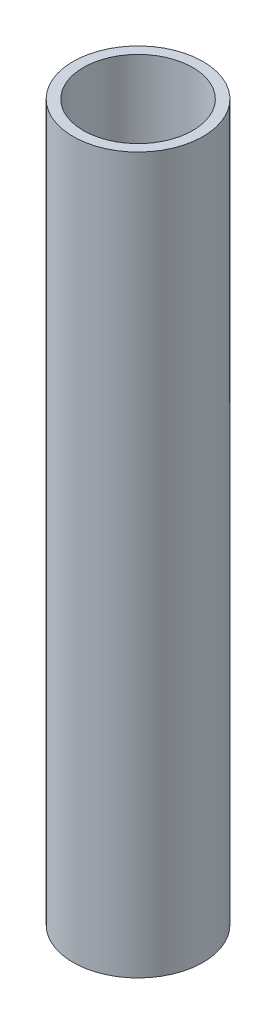
ISO-10303-21;
HEADER;
FILE_DESCRIPTION(('STEP AP214'),'2;1');
FILE_NAME('part.step','',(''),(''),'','','');
FILE_SCHEMA(('AUTOMOTIVE_DESIGN { 1 0 10303 214 1 1 1 1 }'));
ENDSEC;
DATA;
#1=APPLICATION_CONTEXT('core data for automotive mechanical design processes');
#2=APPLICATION_PROTOCOL_DEFINITION('international standard','automotive_design',2000,#1);
#3=PRODUCT_CONTEXT('',#1,'mechanical');
#4=PRODUCT('Part','Part','',(#3));
#5=PRODUCT_RELATED_PRODUCT_CATEGORY('part','',(#4));
#6=PRODUCT_DEFINITION_FORMATION('','',#4);
#7=PRODUCT_DEFINITION_CONTEXT('part definition',#1,'design');
#8=PRODUCT_DEFINITION('design','',#6,#7);
#9=PRODUCT_DEFINITION_SHAPE('','',#8);
#10=(LENGTH_UNIT() NAMED_UNIT(*) SI_UNIT(.MILLI.,.METRE.));
#11=(NAMED_UNIT(*) PLANE_ANGLE_UNIT() SI_UNIT($,.RADIAN.));
#12=(NAMED_UNIT(*) SI_UNIT($,.STERADIAN.) SOLID_ANGLE_UNIT());
#13=UNCERTAINTY_MEASURE_WITH_UNIT(LENGTH_MEASURE(1.E-05),#10,'distance_accuracy_value','');
#14=(GEOMETRIC_REPRESENTATION_CONTEXT(3) GLOBAL_UNCERTAINTY_ASSIGNED_CONTEXT((#13)) GLOBAL_UNIT_ASSIGNED_CONTEXT((#10,
#11,#12)) REPRESENTATION_CONTEXT('',''));
#15=CARTESIAN_POINT('',(0.,0.,0.));
#16=DIRECTION('',(0.,0.,1.));
#17=DIRECTION('',(1.,0.,0.));
#18=AXIS2_PLACEMENT_3D('',#15,#16,#17);
#19=CARTESIAN_POINT('',(0.,104.,0.));
#20=DIRECTION('',(0.,-1.,0.));
#21=DIRECTION('',(0.,0.,-1.));
#22=AXIS2_PLACEMENT_3D('',#19,#20,#21);
#23=CYLINDRICAL_SURFACE('',#22,9.45);
#24=CARTESIAN_POINT('',(0.,104.,0.));
#25=DIRECTION('',(0.,1.,0.));
#26=DIRECTION('',(0.,0.,1.));
#27=AXIS2_PLACEMENT_3D('',#24,#25,#26);
#28=CIRCLE('',#27,9.45);
#29=CARTESIAN_POINT('',(0.,104.,-9.45));
#30=VERTEX_POINT('',#29);
#31=EDGE_CURVE('E10',#30,#30,#28,.T.);
#32=CARTESIAN_POINT('',(0.,0.,0.));
#33=DIRECTION('',(0.,1.,0.));
#34=DIRECTION('',(0.,0.,1.));
#35=AXIS2_PLACEMENT_3D('',#32,#33,#34);
#36=CIRCLE('',#35,9.45);
#37=CARTESIAN_POINT('',(0.,0.,-9.45));
#38=VERTEX_POINT('',#37);
#39=EDGE_CURVE('E42',#38,#38,#36,.T.);
#40=CARTESIAN_POINT('',(0.,104.,-9.45));
#41=CARTESIAN_POINT('',(0.,102.916666666667,-9.45));
#42=CARTESIAN_POINT('',(0.,101.833333333333,-9.45));
#43=CARTESIAN_POINT('',(0.,99.6666666666667,-9.45));
#44=CARTESIAN_POINT('',(0.,98.5833333333333,-9.45));
#45=CARTESIAN_POINT('',(0.,96.4166666666667,-9.45));
#46=CARTESIAN_POINT('',(0.,95.3333333333333,-9.45));
#47=CARTESIAN_POINT('',(0.,93.1666666666667,-9.45));
#48=CARTESIAN_POINT('',(0.,92.0833333333333,-9.45));
#49=CARTESIAN_POINT('',(0.,89.9166666666667,-9.45));
#50=CARTESIAN_POINT('',(0.,88.8333333333333,-9.45));
#51=CARTESIAN_POINT('',(0.,86.6666666666667,-9.45));
#52=CARTESIAN_POINT('',(0.,85.5833333333333,-9.45));
#53=CARTESIAN_POINT('',(0.,83.4166666666667,-9.45));
#54=CARTESIAN_POINT('',(0.,82.3333333333333,-9.45));
#55=CARTESIAN_POINT('',(0.,80.1666666666666,-9.45));
#56=CARTESIAN_POINT('',(0.,79.0833333333333,-9.45));
#57=CARTESIAN_POINT('',(0.,76.9166666666667,-9.45));
#58=CARTESIAN_POINT('',(0.,75.8333333333333,-9.45));
#59=CARTESIAN_POINT('',(0.,73.6666666666667,-9.45));
#60=CARTESIAN_POINT('',(0.,72.5833333333333,-9.45));
#61=CARTESIAN_POINT('',(0.,70.4166666666667,-9.45));
#62=CARTESIAN_POINT('',(0.,69.3333333333333,-9.45));
#63=CARTESIAN_POINT('',(0.,67.1666666666667,-9.45));
#64=CARTESIAN_POINT('',(0.,66.0833333333333,-9.45));
#65=CARTESIAN_POINT('',(0.,63.9166666666667,-9.45));
#66=CARTESIAN_POINT('',(0.,62.8333333333333,-9.45));
#67=CARTESIAN_POINT('',(0.,60.6666666666667,-9.45));
#68=CARTESIAN_POINT('',(0.,59.5833333333333,-9.45));
#69=CARTESIAN_POINT('',(0.,57.4166666666667,-9.45));
#70=CARTESIAN_POINT('',(0.,56.3333333333333,-9.45));
#71=CARTESIAN_POINT('',(0.,54.1666666666667,-9.45));
#72=CARTESIAN_POINT('',(0.,53.0833333333333,-9.45));
#73=CARTESIAN_POINT('',(0.,50.9166666666667,-9.45));
#74=CARTESIAN_POINT('',(0.,49.8333333333333,-9.45));
#75=CARTESIAN_POINT('',(0.,47.6666666666667,-9.45));
#76=CARTESIAN_POINT('',(0.,46.5833333333333,-9.45));
#77=CARTESIAN_POINT('',(0.,44.4166666666667,-9.45));
#78=CARTESIAN_POINT('',(0.,43.3333333333333,-9.45));
#79=CARTESIAN_POINT('',(0.,41.1666666666667,-9.45));
#80=CARTESIAN_POINT('',(0.,40.0833333333333,-9.45));
#81=CARTESIAN_POINT('',(0.,37.9166666666667,-9.45));
#82=CARTESIAN_POINT('',(0.,36.8333333333333,-9.45));
#83=CARTESIAN_POINT('',(0.,34.6666666666667,-9.45));
#84=CARTESIAN_POINT('',(0.,33.5833333333333,-9.45));
#85=CARTESIAN_POINT('',(0.,31.4166666666667,-9.45));
#86=CARTESIAN_POINT('',(0.,30.3333333333333,-9.45));
#87=CARTESIAN_POINT('',(0.,28.1666666666667,-9.45));
#88=CARTESIAN_POINT('',(0.,27.0833333333333,-9.45));
#89=CARTESIAN_POINT('',(0.,24.9166666666667,-9.45));
#90=CARTESIAN_POINT('',(0.,23.8333333333333,-9.45));
#91=CARTESIAN_POINT('',(0.,21.6666666666667,-9.45));
#92=CARTESIAN_POINT('',(0.,20.5833333333333,-9.45));
#93=CARTESIAN_POINT('',(0.,18.4166666666667,-9.45));
#94=CARTESIAN_POINT('',(0.,17.3333333333333,-9.45));
#95=CARTESIAN_POINT('',(0.,15.1666666666667,-9.45));
#96=CARTESIAN_POINT('',(0.,14.0833333333333,-9.45));
#97=CARTESIAN_POINT('',(0.,11.9166666666667,-9.45));
#98=CARTESIAN_POINT('',(0.,10.8333333333333,-9.45));
#99=CARTESIAN_POINT('',(0.,8.66666666666666,-9.45));
#100=CARTESIAN_POINT('',(0.,7.58333333333333,-9.45));
#101=CARTESIAN_POINT('',(0.,5.41666666666667,-9.45));
#102=CARTESIAN_POINT('',(0.,4.33333333333334,-9.45));
#103=CARTESIAN_POINT('',(0.,2.16666666666667,-9.45));
#104=CARTESIAN_POINT('',(0.,1.08333333333333,-9.45));
#105=CARTESIAN_POINT('',(0.,0.,-9.45));
#106=B_SPLINE_CURVE_WITH_KNOTS('',3,(#40,#41,#42,#43,#44,#45,#46,#47,#48,#49,#50,#51,#52,#53,
#54,#55,#56,#57,#58,#59,#60,#61,#62,#63,#64,#65,#66,#67,#68,#69,#70,#71,#72,#73,#74,#75,#76,#77,
#78,#79,#80,#81,#82,#83,#84,#85,#86,#87,#88,#89,#90,#91,#92,#93,#94,#95,#96,#97,#98,#99,#100,
#101,#102,#103,#104,#105),.UNSPECIFIED.,.F.,.F.,(4,2,2,2,2,2,2,2,2,2,2,2,2,2,2,2,2,2,2,2,2,2,2,
2,2,2,2,2,2,2,2,2,4),(0.,3.24999999999999,6.49999999999999,9.74999999999999,13.,16.25,19.5,
22.75,26.,29.25,32.5,35.75,39.,42.25,45.5,48.75,52.,55.25,58.5,61.75,65.,68.25,71.5,74.75,78.,
81.25,84.5,87.75,91.,94.25,97.5,100.75,104.),.UNSPECIFIED.);
#107=EDGE_CURVE('BSEAM39',#30,#38,#106,.T.);
#108=ORIENTED_EDGE('',*,*,#31,.F.);
#109=ORIENTED_EDGE('',*,*,#39,.T.);
#110=ORIENTED_EDGE('',*,*,#107,.T.);
#111=ORIENTED_EDGE('',*,*,#107,.F.);
#112=EDGE_LOOP('',(#108,#110,#109,#111));
#113=FACE_BOUND('',#112,.T.);
#114=ADVANCED_FACE('F39',(#113),#23,.T.);
#115=CARTESIAN_POINT('',(0.,104.,0.));
#116=DIRECTION('',(0.,1.,0.));
#117=DIRECTION('',(0.,0.,1.));
#118=AXIS2_PLACEMENT_3D('',#115,#116,#117);
#119=PLANE('',#118);
#120=CARTESIAN_POINT('',(0.,104.,0.));
#121=DIRECTION('',(0.,1.,0.));
#122=DIRECTION('',(0.,0.,1.));
#123=AXIS2_PLACEMENT_3D('',#120,#121,#122);
#124=CIRCLE('',#123,7.95);
#125=CARTESIAN_POINT('',(0.,104.,7.95));
#126=VERTEX_POINT('',#125);
#127=EDGE_CURVE('E51',#126,#126,#124,.T.);
#128=ORIENTED_EDGE('',*,*,#127,.F.);
#129=EDGE_LOOP('',(#128));
#130=FACE_BOUND('',#129,.T.);
#131=ORIENTED_EDGE('',*,*,#31,.T.);
#132=EDGE_LOOP('',(#131));
#133=FACE_BOUND('',#132,.T.);
#134=ADVANCED_FACE('F66',(#130,#133),#119,.T.);
#135=CARTESIAN_POINT('',(0.,0.,0.));
#136=DIRECTION('',(0.,1.,0.));
#137=DIRECTION('',(0.,0.,1.));
#138=AXIS2_PLACEMENT_3D('',#135,#136,#137);
#139=PLANE('',#138);
#140=ORIENTED_EDGE('',*,*,#39,.F.);
#141=EDGE_LOOP('',(#140));
#142=FACE_BOUND('',#141,.T.);
#143=ADVANCED_FACE('F62',(#142),#139,.F.);
#144=CARTESIAN_POINT('',(0.,1.,0.));
#145=DIRECTION('',(0.,1.,0.));
#146=DIRECTION('',(0.,0.,1.));
#147=AXIS2_PLACEMENT_3D('',#144,#145,#146);
#148=CYLINDRICAL_SURFACE('',#147,7.95);
#149=CARTESIAN_POINT('',(0.,1.,0.));
#150=DIRECTION('',(0.,1.,0.));
#151=DIRECTION('',(0.,0.,1.));
#152=AXIS2_PLACEMENT_3D('',#149,#150,#151);
#153=CIRCLE('',#152,7.95);
#154=CARTESIAN_POINT('',(0.,1.,7.95));
#155=VERTEX_POINT('',#154);
#156=EDGE_CURVE('E49',#155,#155,#153,.T.);
#157=ORIENTED_EDGE('',*,*,#156,.F.);
#158=EDGE_LOOP('',(#157));
#159=FACE_BOUND('',#158,.T.);
#160=ORIENTED_EDGE('',*,*,#127,.T.);
#161=EDGE_LOOP('',(#160));
#162=FACE_BOUND('',#161,.T.);
#163=ADVANCED_FACE('F59',(#159,#162),#148,.F.);
#164=CARTESIAN_POINT('',(0.,1.,0.));
#165=DIRECTION('',(0.,1.,0.));
#166=DIRECTION('',(0.,0.,1.));
#167=AXIS2_PLACEMENT_3D('',#164,#165,#166);
#168=PLANE('',#167);
#169=ORIENTED_EDGE('',*,*,#156,.T.);
#170=EDGE_LOOP('',(#169));
#171=FACE_BOUND('',#170,.T.);
#172=ADVANCED_FACE('F57',(#171),#168,.T.);
#173=CLOSED_SHELL('',(#114,#134,#143,#163,#172));
#174=MANIFOLD_SOLID_BREP('B2',#173);
#175=ADVANCED_BREP_SHAPE_REPRESENTATION('',(#18,#174),#14);
#176=SHAPE_DEFINITION_REPRESENTATION(#9,#175);
ENDSEC;
END-ISO-10303-21;
